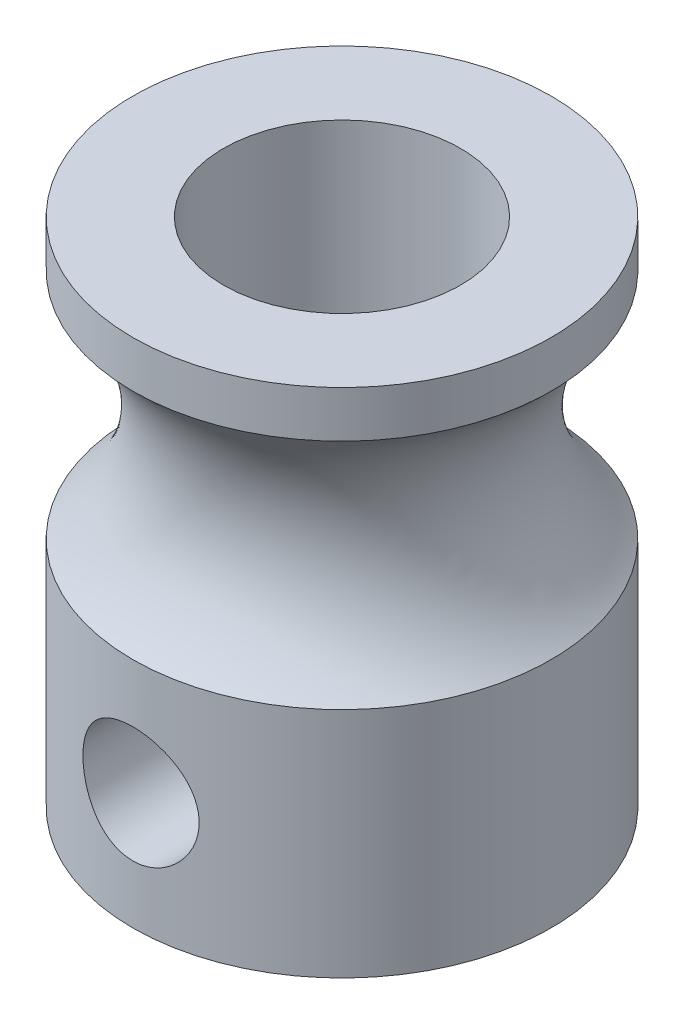
ISO-10303-21;
HEADER;
FILE_DESCRIPTION(('STEP AP214'),'2;1');
FILE_NAME('part.step','',(''),(''),'','','');
FILE_SCHEMA(('AUTOMOTIVE_DESIGN { 1 0 10303 214 1 1 1 1 }'));
ENDSEC;
DATA;
#1=APPLICATION_CONTEXT('core data for automotive mechanical design processes');
#2=APPLICATION_PROTOCOL_DEFINITION('international standard','automotive_design',2000,#1);
#3=PRODUCT_CONTEXT('',#1,'mechanical');
#4=PRODUCT('Part','Part','',(#3));
#5=PRODUCT_RELATED_PRODUCT_CATEGORY('part','',(#4));
#6=PRODUCT_DEFINITION_FORMATION('','',#4);
#7=PRODUCT_DEFINITION_CONTEXT('part definition',#1,'design');
#8=PRODUCT_DEFINITION('design','',#6,#7);
#9=PRODUCT_DEFINITION_SHAPE('','',#8);
#10=(LENGTH_UNIT() NAMED_UNIT(*) SI_UNIT(.MILLI.,.METRE.));
#11=(NAMED_UNIT(*) PLANE_ANGLE_UNIT() SI_UNIT($,.RADIAN.));
#12=(NAMED_UNIT(*) SI_UNIT($,.STERADIAN.) SOLID_ANGLE_UNIT());
#13=UNCERTAINTY_MEASURE_WITH_UNIT(LENGTH_MEASURE(1.E-05),#10,'distance_accuracy_value','');
#14=(GEOMETRIC_REPRESENTATION_CONTEXT(3) GLOBAL_UNCERTAINTY_ASSIGNED_CONTEXT((#13)) GLOBAL_UNIT_ASSIGNED_CONTEXT((#10,
#11,#12)) REPRESENTATION_CONTEXT('',''));
#15=CARTESIAN_POINT('',(0.,0.,0.));
#16=DIRECTION('',(0.,0.,1.));
#17=DIRECTION('',(1.,0.,0.));
#18=AXIS2_PLACEMENT_3D('',#15,#16,#17);
#19=CARTESIAN_POINT('',(0.,11.,0.));
#20=DIRECTION('',(0.,-1.,0.));
#21=DIRECTION('',(0.,0.,-1.));
#22=AXIS2_PLACEMENT_3D('',#19,#20,#21);
#23=CYLINDRICAL_SURFACE('',#22,4.5);
#24=CARTESIAN_POINT('',(0.,10.,0.));
#25=DIRECTION('',(0.,-1.,0.));
#26=DIRECTION('',(0.,0.,-1.));
#27=AXIS2_PLACEMENT_3D('',#24,#25,#26);
#28=CIRCLE('',#27,4.5);
#29=CARTESIAN_POINT('',(0.,10.,-4.5));
#30=VERTEX_POINT('',#29);
#31=EDGE_CURVE('E51',#30,#30,#28,.F.);
#32=ORIENTED_EDGE('',*,*,#31,.T.);
#33=EDGE_LOOP('',(#32));
#34=FACE_BOUND('',#33,.T.);
#35=CARTESIAN_POINT('',(0.,11.,0.));
#36=DIRECTION('',(0.,1.,0.));
#37=DIRECTION('',(0.,0.,1.));
#38=AXIS2_PLACEMENT_3D('',#35,#36,#37);
#39=CIRCLE('',#38,4.5);
#40=CARTESIAN_POINT('',(0.,11.,4.5));
#41=VERTEX_POINT('',#40);
#42=EDGE_CURVE('E12',#41,#41,#39,.T.);
#43=ORIENTED_EDGE('',*,*,#42,.F.);
#44=EDGE_LOOP('',(#43));
#45=FACE_BOUND('',#44,.T.);
#46=ADVANCED_FACE('F47',(#34,#45),#23,.T.);
#47=CARTESIAN_POINT('',(0.,11.,0.));
#48=DIRECTION('',(0.,1.,0.));
#49=DIRECTION('',(0.,0.,1.));
#50=AXIS2_PLACEMENT_3D('',#47,#48,#49);
#51=PLANE('',#50);
#52=ORIENTED_EDGE('',*,*,#42,.T.);
#53=EDGE_LOOP('',(#52));
#54=FACE_BOUND('',#53,.T.);
#55=CARTESIAN_POINT('',(0.,11.,0.));
#56=DIRECTION('',(0.,1.,0.));
#57=DIRECTION('',(0.,0.,1.));
#58=AXIS2_PLACEMENT_3D('',#55,#56,#57);
#59=CIRCLE('',#58,2.55);
#60=CARTESIAN_POINT('',(0.,11.,2.55));
#61=VERTEX_POINT('',#60);
#62=EDGE_CURVE('E60',#61,#61,#59,.T.);
#63=ORIENTED_EDGE('',*,*,#62,.F.);
#64=EDGE_LOOP('',(#63));
#65=FACE_BOUND('',#64,.T.);
#66=ADVANCED_FACE('F103',(#54,#65),#51,.T.);
#67=CARTESIAN_POINT('',(0.,0.,0.));
#68=DIRECTION('',(0.,1.,0.));
#69=DIRECTION('',(0.,0.,1.));
#70=AXIS2_PLACEMENT_3D('',#67,#68,#69);
#71=PLANE('',#70);
#72=CARTESIAN_POINT('',(0.,0.,0.));
#73=DIRECTION('',(0.,1.,0.));
#74=DIRECTION('',(0.,0.,1.));
#75=AXIS2_PLACEMENT_3D('',#72,#73,#74);
#76=CIRCLE('',#75,4.5);
#77=CARTESIAN_POINT('',(0.,0.,4.5));
#78=VERTEX_POINT('',#77);
#79=EDGE_CURVE('E55',#78,#78,#76,.T.);
#80=ORIENTED_EDGE('',*,*,#79,.F.);
#81=EDGE_LOOP('',(#80));
#82=FACE_BOUND('',#81,.T.);
#83=CARTESIAN_POINT('',(0.,0.,0.));
#84=DIRECTION('',(0.,1.,0.));
#85=DIRECTION('',(0.,0.,1.));
#86=AXIS2_PLACEMENT_3D('',#83,#84,#85);
#87=CIRCLE('',#86,2.55);
#88=CARTESIAN_POINT('',(0.,0.,2.55));
#89=VERTEX_POINT('',#88);
#90=EDGE_CURVE('E63',#89,#89,#87,.T.);
#91=ORIENTED_EDGE('',*,*,#90,.T.);
#92=EDGE_LOOP('',(#91));
#93=FACE_BOUND('',#92,.T.);
#94=ADVANCED_FACE('F108',(#82,#93),#71,.F.);
#95=CARTESIAN_POINT('',(-1.24999999999999,2.5,4.32290411644765));
#96=CARTESIAN_POINT('',(-1.24999857498244,2.56874347664407,4.32290518747009));
#97=CARTESIAN_POINT('',(-1.24430988712604,2.63750162003629,4.32456180468303));
#98=CARTESIAN_POINT('',(-1.22175346858591,2.77302429771584,4.33098737036507));
#99=CARTESIAN_POINT('',(-1.20488074482037,2.83978792763889,4.3357577089319));
#100=CARTESIAN_POINT('',(-1.16056004340387,2.96934116337968,4.3478296771143));
#101=CARTESIAN_POINT('',(-1.13312779872145,3.03213652037683,4.35512753927727));
#102=CARTESIAN_POINT('',(-1.06851688708743,3.15224546102772,4.37142737531087));
#103=CARTESIAN_POINT('',(-1.03133723028467,3.20955848714271,4.38042952222604));
#104=CARTESIAN_POINT('',(-0.947207659537752,3.31863092779141,4.39939741122667));
#105=CARTESIAN_POINT('',(-0.900040389354676,3.37021955881808,4.40938137769938));
#106=CARTESIAN_POINT('',(-0.797741434800134,3.46486541951966,4.42903119907275));
#107=CARTESIAN_POINT('',(-0.742608865478606,3.50792169998249,4.43869701848036));
#108=CARTESIAN_POINT('',(-0.624750214452994,3.5850022305806,4.45682601370986));
#109=CARTESIAN_POINT('',(-0.561908163805412,3.6188552959222,4.46526519213644));
#110=CARTESIAN_POINT('',(-0.431150181024709,3.67544963687985,4.47978009156482));
#111=CARTESIAN_POINT('',(-0.363235182945444,3.69819295228698,4.48585624638467));
#112=CARTESIAN_POINT('',(-0.226043180102929,3.73136547273629,4.49483159170207));
#113=CARTESIAN_POINT('',(-0.156841487533507,3.74208552113064,4.49780569025352));
#114=CARTESIAN_POINT('',(-0.0175622284393635,3.75182372832801,4.50050433692141));
#115=CARTESIAN_POINT('',(0.0525151772113886,3.75084400577835,4.50022947337466));
#116=CARTESIAN_POINT('',(0.189527123576272,3.73741222380809,4.49651543187109));
#117=CARTESIAN_POINT('',(0.256495205022548,3.72527461801546,4.49316299037632));
#118=CARTESIAN_POINT('',(0.387403741661239,3.69038143088372,4.48377380049515));
#119=CARTESIAN_POINT('',(0.451344017003042,3.66762521967245,4.47773689287315));
#120=CARTESIAN_POINT('',(0.575166795899739,3.61190895970842,4.46353125303123));
#121=CARTESIAN_POINT('',(0.634999513293936,3.57884404523786,4.45534075392173));
#122=CARTESIAN_POINT('',(0.748372286544125,3.50353019209011,4.43770610675039));
#123=CARTESIAN_POINT('',(0.801911023420059,3.46127933365402,4.42826169679617));
#124=CARTESIAN_POINT('',(0.903053380191144,3.36713567111136,4.40876831613152));
#125=CARTESIAN_POINT('',(0.9504006252949,3.31496909717709,4.39870968477246));
#126=CARTESIAN_POINT('',(1.03574054042555,3.20333366243893,4.37940191575936));
#127=CARTESIAN_POINT('',(1.07373253513776,3.14386427494091,4.37015283657441));
#128=CARTESIAN_POINT('',(1.13950119060978,3.01871763929374,4.35347006971972));
#129=CARTESIAN_POINT('',(1.16720250820497,2.95299886534662,4.34604990034146));
#130=CARTESIAN_POINT('',(1.21107648821783,2.81757820212117,4.33403011245413));
#131=CARTESIAN_POINT('',(1.22725229229959,2.74787740387666,4.32942972536695));
#132=CARTESIAN_POINT('',(1.24716227743049,2.60888274300589,4.3237357416584));
#133=CARTESIAN_POINT('',(1.25128124671117,2.53964838260269,4.32253373160699));
#134=CARTESIAN_POINT('',(1.24802546030741,2.40147900477792,4.32347494363827));
#135=CARTESIAN_POINT('',(1.24065204762323,2.33254395332308,4.32561777484271));
#136=CARTESIAN_POINT('',(1.21496120714198,2.19845112665,4.33290194955527));
#137=CARTESIAN_POINT('',(1.19688029932166,2.13324416557524,4.33797843412408));
#138=CARTESIAN_POINT('',(1.15055629594163,2.00678988645073,4.35049332079077));
#139=CARTESIAN_POINT('',(1.12231179178945,1.94554311864051,4.35793205025996));
#140=CARTESIAN_POINT('',(1.05569785607915,1.8271523157208,4.3745518120738));
#141=CARTESIAN_POINT('',(1.0171053363244,1.77013911448082,4.38376979927329));
#142=CARTESIAN_POINT('',(0.931163609237374,1.66325687796222,4.40282499705416));
#143=CARTESIAN_POINT('',(0.883812610803316,1.6133893076678,4.41266233402015));
#144=CARTESIAN_POINT('',(0.779908718233589,1.52058926471576,4.43222509969555));
#145=CARTESIAN_POINT('',(0.723111799354899,1.47792659496611,4.44193710647942));
#146=CARTESIAN_POINT('',(0.602941556434739,1.40273801446129,4.45983701439328));
#147=CARTESIAN_POINT('',(0.539568581085913,1.37021156660292,4.46802499626981));
#148=CARTESIAN_POINT('',(0.408489197616625,1.31652520408831,4.48190163893738));
#149=CARTESIAN_POINT('',(0.34082005052533,1.2952794169664,4.48760911989691));
#150=CARTESIAN_POINT('',(0.202688156447678,1.26451591327963,4.49596471419449));
#151=CARTESIAN_POINT('',(0.132226089798136,1.2549953584282,4.49861356791422));
#152=CARTESIAN_POINT('',(-0.00698007617882723,1.24814283515687,4.50051521104671));
#153=CARTESIAN_POINT('',(-0.0757035322948379,1.25041664645469,4.49987784493188));
#154=CARTESIAN_POINT('',(-0.211750309863844,1.2661642812453,4.49553044423232));
#155=CARTESIAN_POINT('',(-0.279073691936854,1.27963761878491,4.49182054296648));
#156=CARTESIAN_POINT('',(-0.409892491734701,1.3171716118142,4.48176992045676));
#157=CARTESIAN_POINT('',(-0.473414328140756,1.34114629896691,4.47545058468407));
#158=CARTESIAN_POINT('',(-0.595569603941377,1.39892596911531,4.46083910148551));
#159=CARTESIAN_POINT('',(-0.654202313356981,1.43273241668827,4.45254666017165));
#160=CARTESIAN_POINT('',(-0.766725560865265,1.51033597135891,4.43457698674557));
#161=CARTESIAN_POINT('',(-0.820433633237655,1.55439004303832,4.424867058695));
#162=CARTESIAN_POINT('',(-0.919827817865875,1.65075896522179,4.40527960400557));
#163=CARTESIAN_POINT('',(-0.96551175433025,1.70307604900885,4.39540203270303));
#164=CARTESIAN_POINT('',(-1.04867120954826,1.81602225873568,4.37631776775268));
#165=CARTESIAN_POINT('',(-1.08591898377727,1.87682319482004,4.36713335303392));
#166=CARTESIAN_POINT('',(-1.14961326326321,2.00407199364414,4.35080192911572));
#167=CARTESIAN_POINT('',(-1.17606625417816,2.07051643660506,4.3436536973308));
#168=CARTESIAN_POINT('',(-1.21429747440484,2.19718006485863,4.33310672877768));
#169=CARTESIAN_POINT('',(-1.22765281702806,2.25689470277538,4.32931330336833));
#170=CARTESIAN_POINT('',(-1.24550410246029,2.37773582411498,4.32421169234928));
#171=CARTESIAN_POINT('',(-1.25000126735755,2.43886211160701,4.32290316392017));
#172=CARTESIAN_POINT('',(-1.24999999999999,2.5,4.32290411644765));
#173=B_SPLINE_CURVE_WITH_KNOTS('',3,(#95,#96,#97,#98,#99,#100,#101,#102,#103,#104,#105,#106,
#107,#108,#109,#110,#111,#112,#113,#114,#115,#116,#117,#118,#119,#120,#121,#122,#123,#124,#125,
#126,#127,#128,#129,#130,#131,#132,#133,#134,#135,#136,#137,#138,#139,#140,#141,#142,#143,#144,
#145,#146,#147,#148,#149,#150,#151,#152,#153,#154,#155,#156,#157,#158,#159,#160,#161,#162,#163,
#164,#165,#166,#167,#168,#169,#170,#171,#172),.UNSPECIFIED.,.T.,.F.,(4,2,2,2,2,2,2,2,2,2,2,2,2,
2,2,2,2,2,2,2,2,2,2,2,2,2,2,2,2,2,2,2,2,2,2,2,2,2,4),(0.,0.206005395844479,0.412102824227255,
0.617894362639283,0.823706807313077,1.03456947880014,1.24545559531202,1.46003098375315,
1.67456696053961,1.88379315612369,2.09298146465859,2.29644933759039,2.49992928132026,
2.70555066651714,2.91121506564782,3.1237143777574,3.33622902477098,3.5502702870384,
3.76425318285943,3.97132818882305,4.17837899780673,4.38101838846582,4.58368587413353,
4.79113333818942,4.99862327207954,5.21268753129668,5.42674044564046,5.63913966265409,
5.85148745480912,6.0567843236522,6.26207228502408,6.46571019932811,6.66937846387953,
6.87884344725016,7.08836514088844,7.30300439729125,7.51751450485881,7.70075331478739,
7.88396684302811),.UNSPECIFIED.);
#174=CARTESIAN_POINT('',(-1.24999999999999,2.5,4.32290411644765));
#175=VERTEX_POINT('',#174);
#176=EDGE_CURVE('E72',#175,#175,#173,.T.);
#177=ORIENTED_EDGE('',*,*,#176,.T.);
#178=EDGE_LOOP('',(#177));
#179=FACE_BOUND('',#178,.T.);
#180=CARTESIAN_POINT('',(0.,5.,0.));
#181=DIRECTION('',(0.,1.,0.));
#182=DIRECTION('',(0.,0.,1.));
#183=AXIS2_PLACEMENT_3D('',#180,#181,#182);
#184=CIRCLE('',#183,4.5);
#185=CARTESIAN_POINT('',(0.,5.,4.5));
#186=VERTEX_POINT('',#185);
#187=EDGE_CURVE('E65',#186,#186,#184,.F.);
#188=ORIENTED_EDGE('',*,*,#187,.T.);
#189=EDGE_LOOP('',(#188));
#190=FACE_BOUND('',#189,.T.);
#191=ORIENTED_EDGE('',*,*,#79,.T.);
#192=EDGE_LOOP('',(#191));
#193=FACE_BOUND('',#192,.T.);
#194=ADVANCED_FACE('F49',(#179,#190,#193),#23,.T.);
#195=CARTESIAN_POINT('',(0.,11.,0.));
#196=DIRECTION('',(0.,-1.,0.));
#197=DIRECTION('',(0.,0.,-1.));
#198=AXIS2_PLACEMENT_3D('',#195,#196,#197);
#199=CYLINDRICAL_SURFACE('',#198,2.55);
#200=CARTESIAN_POINT('',(-1.24999999999999,2.5,2.22261107708929));
#201=CARTESIAN_POINT('',(-1.24999563559917,2.56533115617186,2.2226164057041));
#202=CARTESIAN_POINT('',(-1.24484428634917,2.6307492407413,2.22553502612449));
#203=CARTESIAN_POINT('',(-1.22449423516487,2.75959334978353,2.2367925312742));
#204=CARTESIAN_POINT('',(-1.20927359734603,2.82301470769085,2.24514324912958));
#205=CARTESIAN_POINT('',(-1.16958852220713,2.94576036972244,2.26606668628312));
#206=CARTESIAN_POINT('',(-1.14517172896275,3.00510395769583,2.27861760814194));
#207=CARTESIAN_POINT('',(-1.08793254266699,3.11883790580696,2.30649365813439));
#208=CARTESIAN_POINT('',(-1.05510998075533,3.17322816640945,2.32181884199728));
#209=CARTESIAN_POINT('',(-0.978944325885472,3.28026691536494,2.35499979719179));
#210=CARTESIAN_POINT('',(-0.934974384867504,3.33243724506811,2.3729598519965));
#211=CARTESIAN_POINT('',(-0.83906728361981,3.42903264130966,2.40854369387567));
#212=CARTESIAN_POINT('',(-0.787126301144438,3.47345397012317,2.42616731504178));
#213=CARTESIAN_POINT('',(-0.672675692671187,3.55607722867312,2.46044615619748));
#214=CARTESIAN_POINT('',(-0.609701750253379,3.5936971157494,2.47696665644125));
#215=CARTESIAN_POINT('',(-0.477357815345414,3.65759173994277,2.50583391309673));
#216=CARTESIAN_POINT('',(-0.407991737015171,3.68387336463936,2.51818320237391));
#217=CARTESIAN_POINT('',(-0.269893255512082,3.72247201434856,2.53656669574026));
#218=CARTESIAN_POINT('',(-0.201445921975427,3.73562578012716,2.54297709203356));
#219=CARTESIAN_POINT('',(-0.0630382813183104,3.75034447597209,2.55016026306312));
#220=CARTESIAN_POINT('',(0.00692112730528282,3.75191610821229,2.55093629820245));
#221=CARTESIAN_POINT('',(0.140102669036468,3.74376353790547,2.54694719403529));
#222=CARTESIAN_POINT('',(0.203398784332528,3.7349733732242,2.54264021173529));
#223=CARTESIAN_POINT('',(0.32748294091623,3.70800935163721,2.5296536080531));
#224=CARTESIAN_POINT('',(0.38827079470945,3.68983479460848,2.52097366042681));
#225=CARTESIAN_POINT('',(0.506694424226621,3.6444826930583,2.49988663330363));
#226=CARTESIAN_POINT('',(0.564273040504588,3.6171807227334,2.48742827700953));
#227=CARTESIAN_POINT('',(0.674174167307798,3.55451182371811,2.45991934743305));
#228=CARTESIAN_POINT('',(0.726494764944247,3.51914197509183,2.44486783611678));
#229=CARTESIAN_POINT('',(0.829515857435838,3.43760639069726,2.4119679019126));
#230=CARTESIAN_POINT('',(0.879626987847959,3.39074776972887,2.39398956608213));
#231=CARTESIAN_POINT('',(0.971590659358695,3.28942877705643,2.35816712687522));
#232=CARTESIAN_POINT('',(1.01343727347875,3.23496299724961,2.34032312859816));
#233=CARTESIAN_POINT('',(1.0901027062048,3.11601286407092,2.30565638627191));
#234=CARTESIAN_POINT('',(1.12435835774436,3.05112615588367,2.28895675869835));
#235=CARTESIAN_POINT('',(1.1812094945954,2.91549522953248,2.26014830250895));
#236=CARTESIAN_POINT('',(1.2038167456724,2.84475700601468,2.24803484480859));
#237=CARTESIAN_POINT('',(1.23493558332354,2.70526217807256,2.23108208145432));
#238=CARTESIAN_POINT('',(1.2444107104928,2.63678276965051,2.22574826425384));
#239=CARTESIAN_POINT('',(1.25189806828341,2.49902036185923,2.22154782150887));
#240=CARTESIAN_POINT('',(1.24991770159228,2.42973791031278,2.22267701947585));
#241=CARTESIAN_POINT('',(1.23543458711454,2.29994286300497,2.23075166835504));
#242=CARTESIAN_POINT('',(1.2240380532073,2.23926269495886,2.23708529138934));
#243=CARTESIAN_POINT('',(1.19266581555165,2.12078229734046,2.25396607909248));
#244=CARTESIAN_POINT('',(1.17268746372086,2.06298296285274,2.26451454426046));
#245=CARTESIAN_POINT('',(1.12373470885823,1.94886049004132,2.28921429821099));
#246=CARTESIAN_POINT('',(1.09438567502201,1.89273050398797,2.30351013084091));
#247=CARTESIAN_POINT('',(1.02785582398527,1.78587212051716,2.33395588188396));
#248=CARTESIAN_POINT('',(0.990671011518536,1.73514649858994,2.3501067442115));
#249=CARTESIAN_POINT('',(0.904295803171436,1.63416127547542,2.38477738637883));
#250=CARTESIAN_POINT('',(0.854199592348054,1.58469054059736,2.40334856600706));
#251=CARTESIAN_POINT('',(0.746101845632688,1.4946233039457,2.43907183177514));
#252=CARTESIAN_POINT('',(0.688097970349746,1.45402943757997,2.45622349554544));
#253=CARTESIAN_POINT('',(0.563997116754203,1.38211745726769,2.48768787793393));
#254=CARTESIAN_POINT('',(0.497746822511604,1.35102978594044,2.50192765099544));
#255=CARTESIAN_POINT('',(0.360058895510063,1.30074335776818,2.52541452729887));
#256=CARTESIAN_POINT('',(0.288625698626225,1.28153456521775,2.53466584412001));
#257=CARTESIAN_POINT('',(0.149496694651801,1.25714628671862,2.54648466758905));
#258=CARTESIAN_POINT('',(0.082037862222467,1.25086589625809,2.5495758657973));
#259=CARTESIAN_POINT('',(-0.0530284941609052,1.24930241755946,2.55034162963816));
#260=CARTESIAN_POINT('',(-0.120635963041611,1.25401577738723,2.54801794474753));
#261=CARTESIAN_POINT('',(-0.249694765363906,1.27356197767382,2.53852027122617));
#262=CARTESIAN_POINT('',(-0.311268474753133,1.28775209520083,2.5316545880812));
#263=CARTESIAN_POINT('',(-0.431070650348707,1.32500417531389,2.51402996649534));
#264=CARTESIAN_POINT('',(-0.489298617050732,1.34806745868862,2.50327044846343));
#265=CARTESIAN_POINT('',(-0.603611144299944,1.40347622547852,2.47825087805573));
#266=CARTESIAN_POINT('',(-0.659490287362917,1.43618385270284,2.46385820401154));
#267=CARTESIAN_POINT('',(-0.765203763935772,1.50949220398849,2.43310482070762));
#268=CARTESIAN_POINT('',(-0.815035296818627,1.55009656251762,2.41674320657084));
#269=CARTESIAN_POINT('',(-0.912276501411322,1.64257620135834,2.38184160831993));
#270=CARTESIAN_POINT('',(-0.958993938234987,1.69515942197068,2.36324332860785));
#271=CARTESIAN_POINT('',(-1.04317842887749,1.80774144521358,2.32731163014073));
#272=CARTESIAN_POINT('',(-1.0806378317312,1.86774632016834,2.30997926583244));
#273=CARTESIAN_POINT('',(-1.14601093744222,1.99557491627522,2.27827054464228));
#274=CARTESIAN_POINT('',(-1.17365341705266,2.06356042600915,2.26398199312411));
#275=CARTESIAN_POINT('',(-1.2166770873884,2.20410065236873,2.24116172974638));
#276=CARTESIAN_POINT('',(-1.23209937763377,2.27663915997488,2.23261073605662));
#277=CARTESIAN_POINT('',(-1.24398052825433,2.37492658446287,2.22598714495777));
#278=CARTESIAN_POINT('',(-1.24623461970137,2.39986628947385,2.22472517435397));
#279=CARTESIAN_POINT('',(-1.2492452404384,2.44986639001548,2.22303609148967));
#280=CARTESIAN_POINT('',(-1.25000167499752,2.47492679308012,2.22260903203958));
#281=CARTESIAN_POINT('',(-1.24999999999999,2.5,2.22261107708929));
#282=B_SPLINE_CURVE_WITH_KNOTS('',3,(#200,#201,#202,#203,#204,#205,#206,#207,#208,#209,#210,
#211,#212,#213,#214,#215,#216,#217,#218,#219,#220,#221,#222,#223,#224,#225,#226,#227,#228,#229,
#230,#231,#232,#233,#234,#235,#236,#237,#238,#239,#240,#241,#242,#243,#244,#245,#246,#247,#248,
#249,#250,#251,#252,#253,#254,#255,#256,#257,#258,#259,#260,#261,#262,#263,#264,#265,#266,#267,
#268,#269,#270,#271,#272,#273,#274,#275,#276,#277,#278,#279,#280,#281),.UNSPECIFIED.,.T.,.F.,(4,
2,2,2,2,2,2,2,2,2,2,2,2,2,2,2,2,2,2,2,2,2,2,2,2,2,2,2,2,2,2,2,2,2,2,2,2,2,2,2,4),(0.,
0.195888036017307,0.392204224421977,0.587517011170457,0.782833721790561,0.993601398847858,
1.20447046010823,1.42887145190683,1.65313593571192,1.86196281298595,2.07066883998518,
2.26191398779405,2.45317340551787,2.64715429848277,2.84120550894542,3.05306579338261,
3.26507746812371,3.48964844719967,3.7139921457193,3.92080261002325,4.12747944568029,
4.31284211639632,4.49826202540719,4.69229130218181,4.88641975001549,5.10388189756151,
5.32140851893826,5.5438527473241,5.76610878913841,5.96849077543523,6.1708073838685,
6.36063334900776,6.55048758106457,6.74865295747716,6.94690975620571,7.16420728907303,
7.38168380357477,7.60477139611874,7.82710546692581,7.90227986929732,7.97745902650174),.UNSPECIFIED.);
#283=CARTESIAN_POINT('',(-1.24999999999999,2.5,2.22261107708929));
#284=VERTEX_POINT('',#283);
#285=EDGE_CURVE('E67',#284,#284,#282,.T.);
#286=ORIENTED_EDGE('',*,*,#285,.F.);
#287=EDGE_LOOP('',(#286));
#288=FACE_BOUND('',#287,.T.);
#289=ORIENTED_EDGE('',*,*,#62,.T.);
#290=EDGE_LOOP('',(#289));
#291=FACE_BOUND('',#290,.T.);
#292=ORIENTED_EDGE('',*,*,#90,.F.);
#293=EDGE_LOOP('',(#292));
#294=FACE_BOUND('',#293,.T.);
#295=ADVANCED_FACE('F85',(#288,#291,#294),#199,.F.);
#296=CARTESIAN_POINT('',(0.,7.5,0.));
#297=DIRECTION('',(0.,1.,0.));
#298=DIRECTION('',(0.,0.,1.));
#299=AXIS2_PLACEMENT_3D('',#296,#297,#298);
#300=TOROIDAL_SURFACE('',#299,6.64239130434783,3.29239130434783);
#301=ORIENTED_EDGE('',*,*,#187,.F.);
#302=EDGE_LOOP('',(#301));
#303=FACE_BOUND('',#302,.T.);
#304=ORIENTED_EDGE('',*,*,#31,.F.);
#305=EDGE_LOOP('',(#304));
#306=FACE_BOUND('',#305,.T.);
#307=ADVANCED_FACE('F92',(#303,#306),#300,.F.);
#308=CARTESIAN_POINT('',(0.,2.5,0.));
#309=DIRECTION('',(0.,0.,-1.));
#310=DIRECTION('',(-1.,0.,0.));
#311=AXIS2_PLACEMENT_3D('',#308,#309,#310);
#312=CYLINDRICAL_SURFACE('',#311,1.24999999999999);
#313=ORIENTED_EDGE('',*,*,#285,.T.);
#314=EDGE_LOOP('',(#313));
#315=FACE_BOUND('',#314,.T.);
#316=ORIENTED_EDGE('',*,*,#176,.F.);
#317=EDGE_LOOP('',(#316));
#318=FACE_BOUND('',#317,.T.);
#319=ADVANCED_FACE('F89',(#315,#318),#312,.F.);
#320=CLOSED_SHELL('',(#46,#66,#94,#194,#295,#307,#319));
#321=MANIFOLD_SOLID_BREP('B2',#320);
#322=ADVANCED_BREP_SHAPE_REPRESENTATION('',(#18,#321),#14);
#323=SHAPE_DEFINITION_REPRESENTATION(#9,#322);
ENDSEC;
END-ISO-10303-21;
